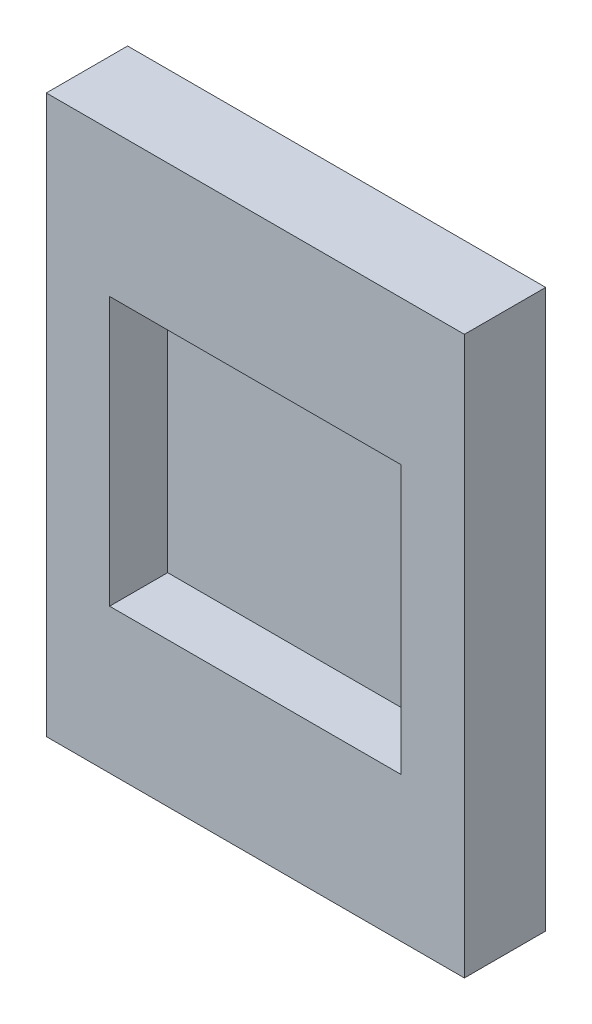
ISO-10303-21;
HEADER;
FILE_DESCRIPTION(('STEP AP214'),'2;1');
FILE_NAME('part.step','',(''),(''),'','','');
FILE_SCHEMA(('AUTOMOTIVE_DESIGN { 1 0 10303 214 1 1 1 1 }'));
ENDSEC;
DATA;
#1=APPLICATION_CONTEXT('core data for automotive mechanical design processes');
#2=APPLICATION_PROTOCOL_DEFINITION('international standard','automotive_design',2000,#1);
#3=PRODUCT_CONTEXT('',#1,'mechanical');
#4=PRODUCT('Part','Part','',(#3));
#5=PRODUCT_RELATED_PRODUCT_CATEGORY('part','',(#4));
#6=PRODUCT_DEFINITION_FORMATION('','',#4);
#7=PRODUCT_DEFINITION_CONTEXT('part definition',#1,'design');
#8=PRODUCT_DEFINITION('design','',#6,#7);
#9=PRODUCT_DEFINITION_SHAPE('','',#8);
#10=(LENGTH_UNIT() NAMED_UNIT(*) SI_UNIT(.MILLI.,.METRE.));
#11=(NAMED_UNIT(*) PLANE_ANGLE_UNIT() SI_UNIT($,.RADIAN.));
#12=(NAMED_UNIT(*) SI_UNIT($,.STERADIAN.) SOLID_ANGLE_UNIT());
#13=UNCERTAINTY_MEASURE_WITH_UNIT(LENGTH_MEASURE(1.E-05),#10,'distance_accuracy_value','');
#14=(GEOMETRIC_REPRESENTATION_CONTEXT(3) GLOBAL_UNCERTAINTY_ASSIGNED_CONTEXT((#13)) GLOBAL_UNIT_ASSIGNED_CONTEXT((#10,
#11,#12)) REPRESENTATION_CONTEXT('',''));
#15=CARTESIAN_POINT('',(0.,0.,0.));
#16=DIRECTION('',(0.,0.,1.));
#17=DIRECTION('',(1.,0.,0.));
#18=AXIS2_PLACEMENT_3D('',#15,#16,#17);
#19=CARTESIAN_POINT('',(9.,-12.,3.5));
#20=DIRECTION('',(-1.,0.,0.));
#21=DIRECTION('',(0.,0.,1.));
#22=AXIS2_PLACEMENT_3D('',#19,#20,#21);
#23=PLANE('',#22);
#24=DIRECTION('',(0.,1.,0.));
#25=VECTOR('',#24,1.);
#26=CARTESIAN_POINT('',(9.,-12.,0.));
#27=LINE('',#26,#25);
#28=CARTESIAN_POINT('',(9.,-12.,0.));
#29=VERTEX_POINT('',#28);
#30=CARTESIAN_POINT('',(9.,12.,0.));
#31=VERTEX_POINT('',#30);
#32=EDGE_CURVE('E158',#29,#31,#27,.T.);
#33=ORIENTED_EDGE('',*,*,#32,.T.);
#34=DIRECTION('',(0.,0.,-1.));
#35=VECTOR('',#34,1.);
#36=CARTESIAN_POINT('',(9.,12.,3.5));
#37=LINE('',#36,#35);
#38=CARTESIAN_POINT('',(9.,12.,3.5));
#39=VERTEX_POINT('',#38);
#40=EDGE_CURVE('E11',#39,#31,#37,.T.);
#41=ORIENTED_EDGE('',*,*,#40,.F.);
#42=DIRECTION('',(0.,1.,0.));
#43=VECTOR('',#42,1.);
#44=CARTESIAN_POINT('',(9.,-12.,3.5));
#45=LINE('',#44,#43);
#46=CARTESIAN_POINT('',(9.,-12.,3.5));
#47=VERTEX_POINT('',#46);
#48=EDGE_CURVE('E164',#47,#39,#45,.T.);
#49=ORIENTED_EDGE('',*,*,#48,.F.);
#50=DIRECTION('',(0.,0.,-1.));
#51=VECTOR('',#50,1.);
#52=CARTESIAN_POINT('',(9.,-12.,3.5));
#53=LINE('',#52,#51);
#54=EDGE_CURVE('E174',#47,#29,#53,.T.);
#55=ORIENTED_EDGE('',*,*,#54,.T.);
#56=EDGE_LOOP('',(#33,#41,#49,#55));
#57=FACE_BOUND('',#56,.T.);
#58=ADVANCED_FACE('F39',(#57),#23,.F.);
#59=CARTESIAN_POINT('',(-9.,12.,3.5));
#60=DIRECTION('',(0.,-1.,0.));
#61=DIRECTION('',(0.,0.,-1.));
#62=AXIS2_PLACEMENT_3D('',#59,#60,#61);
#63=PLANE('',#62);
#64=DIRECTION('',(-1.,0.,0.));
#65=VECTOR('',#64,1.);
#66=CARTESIAN_POINT('',(-9.,12.,0.));
#67=LINE('',#66,#65);
#68=CARTESIAN_POINT('',(-9.,12.,0.));
#69=VERTEX_POINT('',#68);
#70=EDGE_CURVE('E178',#31,#69,#67,.T.);
#71=ORIENTED_EDGE('',*,*,#70,.T.);
#72=DIRECTION('',(0.,0.,-1.));
#73=VECTOR('',#72,1.);
#74=CARTESIAN_POINT('',(-9.,12.,3.5));
#75=LINE('',#74,#73);
#76=CARTESIAN_POINT('',(-9.,12.,3.5));
#77=VERTEX_POINT('',#76);
#78=EDGE_CURVE('E47',#77,#69,#75,.T.);
#79=ORIENTED_EDGE('',*,*,#78,.F.);
#80=DIRECTION('',(-1.,0.,0.));
#81=VECTOR('',#80,1.);
#82=CARTESIAN_POINT('',(-9.,12.,3.5));
#83=LINE('',#82,#81);
#84=EDGE_CURVE('E91',#39,#77,#83,.T.);
#85=ORIENTED_EDGE('',*,*,#84,.F.);
#86=ORIENTED_EDGE('',*,*,#40,.T.);
#87=EDGE_LOOP('',(#71,#79,#85,#86));
#88=FACE_BOUND('',#87,.T.);
#89=ADVANCED_FACE('F213',(#88),#63,.F.);
#90=CARTESIAN_POINT('',(-9.,-12.,3.5));
#91=DIRECTION('',(1.,0.,0.));
#92=DIRECTION('',(0.,0.,-1.));
#93=AXIS2_PLACEMENT_3D('',#90,#91,#92);
#94=PLANE('',#93);
#95=DIRECTION('',(0.,-1.,0.));
#96=VECTOR('',#95,1.);
#97=CARTESIAN_POINT('',(-9.,-12.,0.));
#98=LINE('',#97,#96);
#99=CARTESIAN_POINT('',(-9.,-12.,0.));
#100=VERTEX_POINT('',#99);
#101=EDGE_CURVE('E181',#69,#100,#98,.T.);
#102=ORIENTED_EDGE('',*,*,#101,.T.);
#103=DIRECTION('',(0.,0.,-1.));
#104=VECTOR('',#103,1.);
#105=CARTESIAN_POINT('',(-9.,-12.,3.5));
#106=LINE('',#105,#104);
#107=CARTESIAN_POINT('',(-9.,-12.,3.5));
#108=VERTEX_POINT('',#107);
#109=EDGE_CURVE('E188',#108,#100,#106,.T.);
#110=ORIENTED_EDGE('',*,*,#109,.F.);
#111=DIRECTION('',(0.,-1.,0.));
#112=VECTOR('',#111,1.);
#113=CARTESIAN_POINT('',(-9.,-12.,3.5));
#114=LINE('',#113,#112);
#115=EDGE_CURVE('E169',#77,#108,#114,.T.);
#116=ORIENTED_EDGE('',*,*,#115,.F.);
#117=ORIENTED_EDGE('',*,*,#78,.T.);
#118=EDGE_LOOP('',(#102,#110,#116,#117));
#119=FACE_BOUND('',#118,.T.);
#120=ADVANCED_FACE('F195',(#119),#94,.F.);
#121=CARTESIAN_POINT('',(-9.,-12.,3.5));
#122=DIRECTION('',(0.,1.,0.));
#123=DIRECTION('',(0.,0.,1.));
#124=AXIS2_PLACEMENT_3D('',#121,#122,#123);
#125=PLANE('',#124);
#126=DIRECTION('',(1.,0.,0.));
#127=VECTOR('',#126,1.);
#128=CARTESIAN_POINT('',(-9.,-12.,0.));
#129=LINE('',#128,#127);
#130=EDGE_CURVE('E84',#100,#29,#129,.T.);
#131=ORIENTED_EDGE('',*,*,#130,.T.);
#132=ORIENTED_EDGE('',*,*,#54,.F.);
#133=DIRECTION('',(1.,0.,0.));
#134=VECTOR('',#133,1.);
#135=CARTESIAN_POINT('',(-9.,-12.,3.5));
#136=LINE('',#135,#134);
#137=EDGE_CURVE('E63',#108,#47,#136,.T.);
#138=ORIENTED_EDGE('',*,*,#137,.F.);
#139=ORIENTED_EDGE('',*,*,#109,.T.);
#140=EDGE_LOOP('',(#131,#132,#138,#139));
#141=FACE_BOUND('',#140,.T.);
#142=ADVANCED_FACE('F203',(#141),#125,.F.);
#143=CARTESIAN_POINT('',(0.,0.,3.5));
#144=DIRECTION('',(0.,0.,-1.));
#145=DIRECTION('',(-1.,0.,0.));
#146=AXIS2_PLACEMENT_3D('',#143,#144,#145);
#147=PLANE('',#146);
#148=DIRECTION('',(-1.,0.,0.));
#149=VECTOR('',#148,1.);
#150=CARTESIAN_POINT('',(-6.275,5.775,3.5));
#151=LINE('',#150,#149);
#152=CARTESIAN_POINT('',(6.275,5.775,3.5));
#153=VERTEX_POINT('',#152);
#154=CARTESIAN_POINT('',(-6.275,5.775,3.5));
#155=VERTEX_POINT('',#154);
#156=EDGE_CURVE('E149',#153,#155,#151,.T.);
#157=ORIENTED_EDGE('',*,*,#156,.F.);
#158=DIRECTION('',(0.,1.,0.));
#159=VECTOR('',#158,1.);
#160=CARTESIAN_POINT('',(6.275,-5.775,3.5));
#161=LINE('',#160,#159);
#162=CARTESIAN_POINT('',(6.275,-5.775,3.5));
#163=VERTEX_POINT('',#162);
#164=EDGE_CURVE('E54',#163,#153,#161,.T.);
#165=ORIENTED_EDGE('',*,*,#164,.F.);
#166=DIRECTION('',(1.,0.,0.));
#167=VECTOR('',#166,1.);
#168=CARTESIAN_POINT('',(-6.275,-5.775,3.5));
#169=LINE('',#168,#167);
#170=CARTESIAN_POINT('',(-6.275,-5.775,3.5));
#171=VERTEX_POINT('',#170);
#172=EDGE_CURVE('E136',#171,#163,#169,.T.);
#173=ORIENTED_EDGE('',*,*,#172,.F.);
#174=DIRECTION('',(0.,-1.,0.));
#175=VECTOR('',#174,1.);
#176=CARTESIAN_POINT('',(-6.275,-5.775,3.5));
#177=LINE('',#176,#175);
#178=EDGE_CURVE('E140',#155,#171,#177,.T.);
#179=ORIENTED_EDGE('',*,*,#178,.F.);
#180=EDGE_LOOP('',(#157,#165,#173,#179));
#181=FACE_BOUND('',#180,.T.);
#182=ORIENTED_EDGE('',*,*,#48,.T.);
#183=ORIENTED_EDGE('',*,*,#84,.T.);
#184=ORIENTED_EDGE('',*,*,#115,.T.);
#185=ORIENTED_EDGE('',*,*,#137,.T.);
#186=EDGE_LOOP('',(#182,#183,#184,#185));
#187=FACE_BOUND('',#186,.T.);
#188=ADVANCED_FACE('F205',(#181,#187),#147,.F.);
#189=CARTESIAN_POINT('',(0.,0.,0.));
#190=DIRECTION('',(0.,0.,-1.));
#191=DIRECTION('',(-1.,0.,0.));
#192=AXIS2_PLACEMENT_3D('',#189,#190,#191);
#193=PLANE('',#192);
#194=ORIENTED_EDGE('',*,*,#32,.F.);
#195=ORIENTED_EDGE('',*,*,#130,.F.);
#196=ORIENTED_EDGE('',*,*,#101,.F.);
#197=ORIENTED_EDGE('',*,*,#70,.F.);
#198=EDGE_LOOP('',(#194,#195,#196,#197));
#199=FACE_BOUND('',#198,.T.);
#200=ADVANCED_FACE('F199',(#199),#193,.T.);
#201=CARTESIAN_POINT('',(6.275,-5.775,1.));
#202=DIRECTION('',(1.,0.,0.));
#203=DIRECTION('',(0.,0.,-1.));
#204=AXIS2_PLACEMENT_3D('',#201,#202,#203);
#205=PLANE('',#204);
#206=ORIENTED_EDGE('',*,*,#164,.T.);
#207=DIRECTION('',(0.,0.,1.));
#208=VECTOR('',#207,1.);
#209=CARTESIAN_POINT('',(6.275,5.775,1.));
#210=LINE('',#209,#208);
#211=CARTESIAN_POINT('',(6.275,5.775,1.));
#212=VERTEX_POINT('',#211);
#213=EDGE_CURVE('E111',#212,#153,#210,.T.);
#214=ORIENTED_EDGE('',*,*,#213,.F.);
#215=DIRECTION('',(0.,1.,0.));
#216=VECTOR('',#215,1.);
#217=CARTESIAN_POINT('',(6.275,-5.775,1.));
#218=LINE('',#217,#216);
#219=CARTESIAN_POINT('',(6.275,-5.775,1.));
#220=VERTEX_POINT('',#219);
#221=EDGE_CURVE('E115',#220,#212,#218,.T.);
#222=ORIENTED_EDGE('',*,*,#221,.F.);
#223=DIRECTION('',(0.,0.,1.));
#224=VECTOR('',#223,1.);
#225=CARTESIAN_POINT('',(6.275,-5.775,1.));
#226=LINE('',#225,#224);
#227=EDGE_CURVE('E155',#220,#163,#226,.T.);
#228=ORIENTED_EDGE('',*,*,#227,.T.);
#229=EDGE_LOOP('',(#206,#214,#222,#228));
#230=FACE_BOUND('',#229,.T.);
#231=ADVANCED_FACE('F113',(#230),#205,.F.);
#232=CARTESIAN_POINT('',(-6.275,-5.775,1.));
#233=DIRECTION('',(0.,-1.,0.));
#234=DIRECTION('',(0.,0.,-1.));
#235=AXIS2_PLACEMENT_3D('',#232,#233,#234);
#236=PLANE('',#235);
#237=ORIENTED_EDGE('',*,*,#172,.T.);
#238=ORIENTED_EDGE('',*,*,#227,.F.);
#239=DIRECTION('',(1.,0.,0.));
#240=VECTOR('',#239,1.);
#241=CARTESIAN_POINT('',(-6.275,-5.775,1.));
#242=LINE('',#241,#240);
#243=CARTESIAN_POINT('',(-6.275,-5.775,1.));
#244=VERTEX_POINT('',#243);
#245=EDGE_CURVE('E122',#244,#220,#242,.T.);
#246=ORIENTED_EDGE('',*,*,#245,.F.);
#247=DIRECTION('',(0.,0.,1.));
#248=VECTOR('',#247,1.);
#249=CARTESIAN_POINT('',(-6.275,-5.775,1.));
#250=LINE('',#249,#248);
#251=EDGE_CURVE('E159',#244,#171,#250,.T.);
#252=ORIENTED_EDGE('',*,*,#251,.T.);
#253=EDGE_LOOP('',(#237,#238,#246,#252));
#254=FACE_BOUND('',#253,.T.);
#255=ADVANCED_FACE('F252',(#254),#236,.F.);
#256=CARTESIAN_POINT('',(-6.275,-5.775,1.));
#257=DIRECTION('',(-1.,0.,0.));
#258=DIRECTION('',(0.,0.,1.));
#259=AXIS2_PLACEMENT_3D('',#256,#257,#258);
#260=PLANE('',#259);
#261=ORIENTED_EDGE('',*,*,#178,.T.);
#262=ORIENTED_EDGE('',*,*,#251,.F.);
#263=DIRECTION('',(0.,-1.,0.));
#264=VECTOR('',#263,1.);
#265=CARTESIAN_POINT('',(-6.275,-5.775,1.));
#266=LINE('',#265,#264);
#267=CARTESIAN_POINT('',(-6.275,5.775,1.));
#268=VERTEX_POINT('',#267);
#269=EDGE_CURVE('E131',#268,#244,#266,.T.);
#270=ORIENTED_EDGE('',*,*,#269,.F.);
#271=DIRECTION('',(0.,0.,1.));
#272=VECTOR('',#271,1.);
#273=CARTESIAN_POINT('',(-6.275,5.775,1.));
#274=LINE('',#273,#272);
#275=EDGE_CURVE('E121',#268,#155,#274,.T.);
#276=ORIENTED_EDGE('',*,*,#275,.T.);
#277=EDGE_LOOP('',(#261,#262,#270,#276));
#278=FACE_BOUND('',#277,.T.);
#279=ADVANCED_FACE('F261',(#278),#260,.F.);
#280=CARTESIAN_POINT('',(-6.275,5.775,1.));
#281=DIRECTION('',(0.,1.,0.));
#282=DIRECTION('',(0.,0.,1.));
#283=AXIS2_PLACEMENT_3D('',#280,#281,#282);
#284=PLANE('',#283);
#285=ORIENTED_EDGE('',*,*,#156,.T.);
#286=ORIENTED_EDGE('',*,*,#275,.F.);
#287=DIRECTION('',(-1.,0.,0.));
#288=VECTOR('',#287,1.);
#289=CARTESIAN_POINT('',(-6.275,5.775,1.));
#290=LINE('',#289,#288);
#291=EDGE_CURVE('E125',#212,#268,#290,.T.);
#292=ORIENTED_EDGE('',*,*,#291,.F.);
#293=ORIENTED_EDGE('',*,*,#213,.T.);
#294=EDGE_LOOP('',(#285,#286,#292,#293));
#295=FACE_BOUND('',#294,.T.);
#296=ADVANCED_FACE('F126',(#295),#284,.F.);
#297=CARTESIAN_POINT('',(0.,0.,1.));
#298=DIRECTION('',(0.,0.,-1.));
#299=DIRECTION('',(-1.,0.,0.));
#300=AXIS2_PLACEMENT_3D('',#297,#298,#299);
#301=PLANE('',#300);
#302=ORIENTED_EDGE('',*,*,#221,.T.);
#303=ORIENTED_EDGE('',*,*,#291,.T.);
#304=ORIENTED_EDGE('',*,*,#269,.T.);
#305=ORIENTED_EDGE('',*,*,#245,.T.);
#306=EDGE_LOOP('',(#302,#303,#304,#305));
#307=FACE_BOUND('',#306,.T.);
#308=ADVANCED_FACE('F133',(#307),#301,.F.);
#309=CLOSED_SHELL('',(#58,#89,#120,#142,#188,#200,#231,#255,#279,#296,#308));
#310=MANIFOLD_SOLID_BREP('B2',#309);
#311=ADVANCED_BREP_SHAPE_REPRESENTATION('',(#18,#310),#14);
#312=SHAPE_DEFINITION_REPRESENTATION(#9,#311);
ENDSEC;
END-ISO-10303-21;
